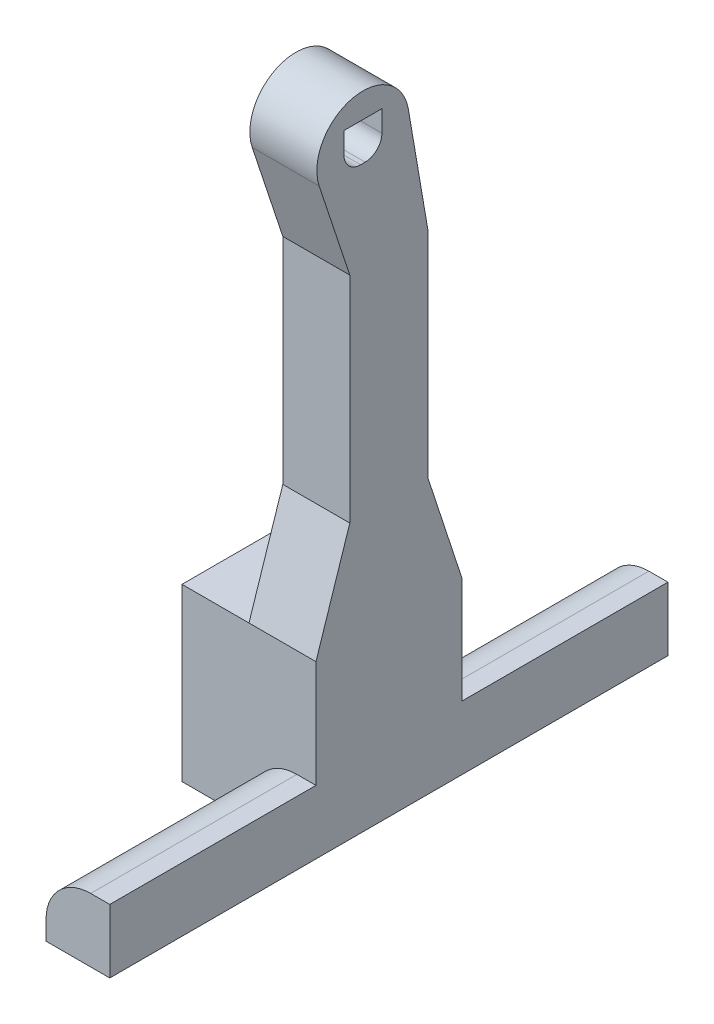
ISO-10303-21;
HEADER;
FILE_DESCRIPTION(('STEP AP214'),'2;1');
FILE_NAME('part.step','',(''),(''),'','','');
FILE_SCHEMA(('AUTOMOTIVE_DESIGN { 1 0 10303 214 1 1 1 1 }'));
ENDSEC;
DATA;
#1=APPLICATION_CONTEXT('core data for automotive mechanical design processes');
#2=APPLICATION_PROTOCOL_DEFINITION('international standard','automotive_design',2000,#1);
#3=PRODUCT_CONTEXT('',#1,'mechanical');
#4=PRODUCT('Part','Part','',(#3));
#5=PRODUCT_RELATED_PRODUCT_CATEGORY('part','',(#4));
#6=PRODUCT_DEFINITION_FORMATION('','',#4);
#7=PRODUCT_DEFINITION_CONTEXT('part definition',#1,'design');
#8=PRODUCT_DEFINITION('design','',#6,#7);
#9=PRODUCT_DEFINITION_SHAPE('','',#8);
#10=(LENGTH_UNIT() NAMED_UNIT(*) SI_UNIT(.MILLI.,.METRE.));
#11=(NAMED_UNIT(*) PLANE_ANGLE_UNIT() SI_UNIT($,.RADIAN.));
#12=(NAMED_UNIT(*) SI_UNIT($,.STERADIAN.) SOLID_ANGLE_UNIT());
#13=UNCERTAINTY_MEASURE_WITH_UNIT(LENGTH_MEASURE(1.E-05),#10,'distance_accuracy_value','');
#14=(GEOMETRIC_REPRESENTATION_CONTEXT(3) GLOBAL_UNCERTAINTY_ASSIGNED_CONTEXT((#13)) GLOBAL_UNIT_ASSIGNED_CONTEXT((#10,
#11,#12)) REPRESENTATION_CONTEXT('',''));
#15=CARTESIAN_POINT('',(0.,0.,0.));
#16=DIRECTION('',(0.,0.,1.));
#17=DIRECTION('',(1.,0.,0.));
#18=AXIS2_PLACEMENT_3D('',#15,#16,#17);
#19=CARTESIAN_POINT('',(-6.,0.,-6.5301128643398));
#20=DIRECTION('',(0.,0.,-1.));
#21=DIRECTION('',(0.,1.,0.));
#22=AXIS2_PLACEMENT_3D('',#19,#20,#21);
#23=PLANE('',#22);
#24=DIRECTION('',(0.,1.,0.));
#25=VECTOR('',#24,1.);
#26=CARTESIAN_POINT('',(6.,0.,-6.5301128643398));
#27=LINE('',#26,#25);
#28=CARTESIAN_POINT('',(6.,5.70719146421949,-6.5301128643398));
#29=VERTEX_POINT('',#28);
#30=CARTESIAN_POINT('',(6.,15.3052734001084,-6.5301128643398));
#31=VERTEX_POINT('',#30);
#32=EDGE_CURVE('E293',#29,#31,#27,.T.);
#33=ORIENTED_EDGE('',*,*,#32,.F.);
#34=DIRECTION('',(-1.,0.,0.));
#35=VECTOR('',#34,1.);
#36=CARTESIAN_POINT('',(-6.,5.70719146421949,-6.5301128643398));
#37=LINE('',#36,#35);
#38=CARTESIAN_POINT('',(4.29280853578054,5.70719146421949,-6.5301128643398));
#39=VERTEX_POINT('',#38);
#40=EDGE_CURVE('E228',#29,#39,#37,.T.);
#41=ORIENTED_EDGE('',*,*,#40,.T.);
#42=CARTESIAN_POINT('',(4.29280853578051,1.70719146421949,-6.5301128643398));
#43=DIRECTION('',(0.,0.,-1.));
#44=DIRECTION('',(0.,1.,0.));
#45=AXIS2_PLACEMENT_3D('',#42,#43,#44);
#46=CIRCLE('',#45,4.);
#47=CARTESIAN_POINT('',(0.292808535780509,1.70719146421946,-6.5301128643398));
#48=VERTEX_POINT('',#47);
#49=EDGE_CURVE('E288',#39,#48,#46,.F.);
#50=ORIENTED_EDGE('',*,*,#49,.T.);
#51=DIRECTION('',(0.,-1.,0.));
#52=VECTOR('',#51,1.);
#53=CARTESIAN_POINT('',(0.292808535780509,0.,-6.5301128643398));
#54=LINE('',#53,#52);
#55=CARTESIAN_POINT('',(0.292808535780509,0.,-6.5301128643398));
#56=VERTEX_POINT('',#55);
#57=EDGE_CURVE('E285',#48,#56,#54,.T.);
#58=ORIENTED_EDGE('',*,*,#57,.T.);
#59=DIRECTION('',(1.,0.,0.));
#60=VECTOR('',#59,1.);
#61=CARTESIAN_POINT('',(-6.,0.,-6.5301128643398));
#62=LINE('',#61,#60);
#63=CARTESIAN_POINT('',(-6.,0.,-6.5301128643398));
#64=VERTEX_POINT('',#63);
#65=EDGE_CURVE('E378',#64,#56,#62,.T.);
#66=ORIENTED_EDGE('',*,*,#65,.F.);
#67=DIRECTION('',(0.,1.,0.));
#68=VECTOR('',#67,1.);
#69=CARTESIAN_POINT('',(-6.,0.,-6.5301128643398));
#70=LINE('',#69,#68);
#71=CARTESIAN_POINT('',(-6.,15.3052734001084,-6.5301128643398));
#72=VERTEX_POINT('',#71);
#73=EDGE_CURVE('E345',#64,#72,#70,.T.);
#74=ORIENTED_EDGE('',*,*,#73,.T.);
#75=DIRECTION('',(1.,0.,0.));
#76=VECTOR('',#75,1.);
#77=CARTESIAN_POINT('',(-6.,15.3052734001084,-6.5301128643398));
#78=LINE('',#77,#76);
#79=CARTESIAN_POINT('',(0.,15.3052734001084,-6.5301128643398));
#80=VERTEX_POINT('',#79);
#81=EDGE_CURVE('E367',#72,#80,#78,.T.);
#82=ORIENTED_EDGE('',*,*,#81,.T.);
#83=DIRECTION('',(-1.,0.,0.));
#84=VECTOR('',#83,1.);
#85=CARTESIAN_POINT('',(6.,15.3052734001084,-6.5301128643398));
#86=LINE('',#85,#84);
#87=EDGE_CURVE('E343',#31,#80,#86,.T.);
#88=ORIENTED_EDGE('',*,*,#87,.F.);
#89=EDGE_LOOP('',(#33,#41,#50,#58,#66,#74,#82,#88));
#90=FACE_BOUND('',#89,.T.);
#91=ADVANCED_FACE('F37',(#90),#23,.T.);
#92=CARTESIAN_POINT('',(-6.,0.,6.5301128643398));
#93=DIRECTION('',(0.,0.,-1.));
#94=DIRECTION('',(-1.,0.,0.));
#95=AXIS2_PLACEMENT_3D('',#92,#93,#94);
#96=PLANE('',#95);
#97=DIRECTION('',(-1.,0.,0.));
#98=VECTOR('',#97,1.);
#99=CARTESIAN_POINT('',(-6.,5.70719146421949,6.5301128643398));
#100=LINE('',#99,#98);
#101=CARTESIAN_POINT('',(6.,5.70719146421949,6.5301128643398));
#102=VERTEX_POINT('',#101);
#103=CARTESIAN_POINT('',(4.29280853578054,5.70719146421949,6.5301128643398));
#104=VERTEX_POINT('',#103);
#105=EDGE_CURVE('E282',#102,#104,#100,.T.);
#106=ORIENTED_EDGE('',*,*,#105,.F.);
#107=DIRECTION('',(0.,1.,0.));
#108=VECTOR('',#107,1.);
#109=CARTESIAN_POINT('',(6.,0.,6.5301128643398));
#110=LINE('',#109,#108);
#111=CARTESIAN_POINT('',(6.,15.3052734001084,6.5301128643398));
#112=VERTEX_POINT('',#111);
#113=EDGE_CURVE('E314',#102,#112,#110,.T.);
#114=ORIENTED_EDGE('',*,*,#113,.T.);
#115=DIRECTION('',(-1.,0.,0.));
#116=VECTOR('',#115,1.);
#117=CARTESIAN_POINT('',(6.,15.3052734001084,6.5301128643398));
#118=LINE('',#117,#116);
#119=CARTESIAN_POINT('',(0.,15.3052734001084,6.5301128643398));
#120=VERTEX_POINT('',#119);
#121=EDGE_CURVE('E334',#112,#120,#118,.T.);
#122=ORIENTED_EDGE('',*,*,#121,.T.);
#123=DIRECTION('',(1.,0.,0.));
#124=VECTOR('',#123,1.);
#125=CARTESIAN_POINT('',(-6.,15.3052734001084,6.5301128643398));
#126=LINE('',#125,#124);
#127=CARTESIAN_POINT('',(-6.,15.3052734001084,6.5301128643398));
#128=VERTEX_POINT('',#127);
#129=EDGE_CURVE('E416',#128,#120,#126,.T.);
#130=ORIENTED_EDGE('',*,*,#129,.F.);
#131=DIRECTION('',(0.,1.,0.));
#132=VECTOR('',#131,1.);
#133=CARTESIAN_POINT('',(-6.,0.,6.5301128643398));
#134=LINE('',#133,#132);
#135=CARTESIAN_POINT('',(-6.,0.,6.5301128643398));
#136=VERTEX_POINT('',#135);
#137=EDGE_CURVE('E352',#136,#128,#134,.T.);
#138=ORIENTED_EDGE('',*,*,#137,.F.);
#139=DIRECTION('',(1.,0.,0.));
#140=VECTOR('',#139,1.);
#141=CARTESIAN_POINT('',(-6.,0.,6.5301128643398));
#142=LINE('',#141,#140);
#143=CARTESIAN_POINT('',(0.292808535780509,0.,6.5301128643398));
#144=VERTEX_POINT('',#143);
#145=EDGE_CURVE('E397',#136,#144,#142,.T.);
#146=ORIENTED_EDGE('',*,*,#145,.T.);
#147=DIRECTION('',(0.,-1.,0.));
#148=VECTOR('',#147,1.);
#149=CARTESIAN_POINT('',(0.292808535780509,0.,6.5301128643398));
#150=LINE('',#149,#148);
#151=CARTESIAN_POINT('',(0.292808535780509,1.70719146421946,6.5301128643398));
#152=VERTEX_POINT('',#151);
#153=EDGE_CURVE('E44',#152,#144,#150,.T.);
#154=ORIENTED_EDGE('',*,*,#153,.F.);
#155=CARTESIAN_POINT('',(4.29280853578051,1.70719146421949,6.5301128643398));
#156=DIRECTION('',(0.,0.,-1.));
#157=DIRECTION('',(-1.,0.,0.));
#158=AXIS2_PLACEMENT_3D('',#155,#156,#157);
#159=CIRCLE('',#158,4.);
#160=EDGE_CURVE('E11',#104,#152,#159,.F.);
#161=ORIENTED_EDGE('',*,*,#160,.F.);
#162=EDGE_LOOP('',(#106,#114,#122,#130,#138,#146,#154,#161));
#163=FACE_BOUND('',#162,.T.);
#164=ADVANCED_FACE('F439',(#163),#96,.F.);
#165=CARTESIAN_POINT('',(-6.,0.,0.));
#166=DIRECTION('',(0.,-1.,0.));
#167=DIRECTION('',(0.,0.,-1.));
#168=AXIS2_PLACEMENT_3D('',#165,#166,#167);
#169=PLANE('',#168);
#170=DIRECTION('',(0.,0.,-1.));
#171=VECTOR('',#170,1.);
#172=CARTESIAN_POINT('',(0.292808535780509,0.,25.));
#173=LINE('',#172,#171);
#174=CARTESIAN_POINT('',(0.292808535780509,0.,25.));
#175=VERTEX_POINT('',#174);
#176=EDGE_CURVE('E271',#175,#144,#173,.T.);
#177=ORIENTED_EDGE('',*,*,#176,.T.);
#178=ORIENTED_EDGE('',*,*,#145,.F.);
#179=DIRECTION('',(0.,0.,1.));
#180=VECTOR('',#179,1.);
#181=CARTESIAN_POINT('',(-6.,0.,0.));
#182=LINE('',#181,#180);
#183=CARTESIAN_POINT('',(-6.,0.,3.));
#184=VERTEX_POINT('',#183);
#185=EDGE_CURVE('E354',#184,#136,#182,.T.);
#186=ORIENTED_EDGE('',*,*,#185,.F.);
#187=DIRECTION('',(1.,0.,0.));
#188=VECTOR('',#187,1.);
#189=CARTESIAN_POINT('',(-6.,0.,3.));
#190=LINE('',#189,#188);
#191=CARTESIAN_POINT('',(0.,0.,3.));
#192=VERTEX_POINT('',#191);
#193=EDGE_CURVE('E393',#184,#192,#190,.T.);
#194=ORIENTED_EDGE('',*,*,#193,.T.);
#195=DIRECTION('',(0.,0.,1.));
#196=VECTOR('',#195,1.);
#197=CARTESIAN_POINT('',(0.,0.,0.));
#198=LINE('',#197,#196);
#199=CARTESIAN_POINT('',(0.,0.,-3.));
#200=VERTEX_POINT('',#199);
#201=EDGE_CURVE('E291',#200,#192,#198,.T.);
#202=ORIENTED_EDGE('',*,*,#201,.F.);
#203=DIRECTION('',(1.,0.,0.));
#204=VECTOR('',#203,1.);
#205=CARTESIAN_POINT('',(-6.,0.,-3.));
#206=LINE('',#205,#204);
#207=CARTESIAN_POINT('',(-6.,0.,-3.));
#208=VERTEX_POINT('',#207);
#209=EDGE_CURVE('E385',#208,#200,#206,.T.);
#210=ORIENTED_EDGE('',*,*,#209,.F.);
#211=DIRECTION('',(0.,0.,-1.));
#212=VECTOR('',#211,1.);
#213=CARTESIAN_POINT('',(-6.,0.,0.));
#214=LINE('',#213,#212);
#215=EDGE_CURVE('E364',#208,#64,#214,.T.);
#216=ORIENTED_EDGE('',*,*,#215,.T.);
#217=ORIENTED_EDGE('',*,*,#65,.T.);
#218=CARTESIAN_POINT('',(0.292808535780509,0.,-25.));
#219=VERTEX_POINT('',#218);
#220=EDGE_CURVE('E270',#56,#219,#173,.T.);
#221=ORIENTED_EDGE('',*,*,#220,.T.);
#222=DIRECTION('',(1.,0.,0.));
#223=VECTOR('',#222,1.);
#224=CARTESIAN_POINT('',(6.,0.,-25.));
#225=LINE('',#224,#223);
#226=CARTESIAN_POINT('',(6.,0.,-25.));
#227=VERTEX_POINT('',#226);
#228=EDGE_CURVE('E256',#219,#227,#225,.T.);
#229=ORIENTED_EDGE('',*,*,#228,.T.);
#230=DIRECTION('',(0.,0.,1.));
#231=VECTOR('',#230,1.);
#232=CARTESIAN_POINT('',(6.,0.,0.));
#233=LINE('',#232,#231);
#234=CARTESIAN_POINT('',(6.,0.,25.));
#235=VERTEX_POINT('',#234);
#236=EDGE_CURVE('E249',#227,#235,#233,.T.);
#237=ORIENTED_EDGE('',*,*,#236,.T.);
#238=DIRECTION('',(1.,0.,0.));
#239=VECTOR('',#238,1.);
#240=CARTESIAN_POINT('',(6.,0.,25.));
#241=LINE('',#240,#239);
#242=EDGE_CURVE('E267',#175,#235,#241,.T.);
#243=ORIENTED_EDGE('',*,*,#242,.F.);
#244=EDGE_LOOP('',(#177,#178,#186,#194,#202,#210,#216,#217,#221,#229,#237,#243));
#245=FACE_BOUND('',#244,.T.);
#246=ADVANCED_FACE('F403',(#245),#169,.T.);
#247=CARTESIAN_POINT('',(-6.,0.,-3.));
#248=DIRECTION('',(0.,0.,1.));
#249=DIRECTION('',(0.,-1.,0.));
#250=AXIS2_PLACEMENT_3D('',#247,#248,#249);
#251=PLANE('',#250);
#252=DIRECTION('',(0.,-1.,0.));
#253=VECTOR('',#252,1.);
#254=CARTESIAN_POINT('',(0.,0.,-3.));
#255=LINE('',#254,#253);
#256=CARTESIAN_POINT('',(0.,9.82,-3.));
#257=VERTEX_POINT('',#256);
#258=EDGE_CURVE('E349',#257,#200,#255,.T.);
#259=ORIENTED_EDGE('',*,*,#258,.F.);
#260=DIRECTION('',(1.,0.,0.));
#261=VECTOR('',#260,1.);
#262=CARTESIAN_POINT('',(-6.,9.82,-3.));
#263=LINE('',#262,#261);
#264=CARTESIAN_POINT('',(-6.,9.82,-3.));
#265=VERTEX_POINT('',#264);
#266=EDGE_CURVE('E387',#265,#257,#263,.T.);
#267=ORIENTED_EDGE('',*,*,#266,.F.);
#268=DIRECTION('',(0.,-1.,0.));
#269=VECTOR('',#268,1.);
#270=CARTESIAN_POINT('',(-6.,0.,-3.));
#271=LINE('',#270,#269);
#272=EDGE_CURVE('E361',#265,#208,#271,.T.);
#273=ORIENTED_EDGE('',*,*,#272,.T.);
#274=ORIENTED_EDGE('',*,*,#209,.T.);
#275=EDGE_LOOP('',(#259,#267,#273,#274));
#276=FACE_BOUND('',#275,.T.);
#277=ADVANCED_FACE('F428',(#276),#251,.T.);
#278=CARTESIAN_POINT('',(-6.,9.82,0.));
#279=DIRECTION('',(0.,-1.,0.));
#280=DIRECTION('',(0.,0.,-1.));
#281=AXIS2_PLACEMENT_3D('',#278,#279,#280);
#282=PLANE('',#281);
#283=DIRECTION('',(0.,0.,-1.));
#284=VECTOR('',#283,1.);
#285=CARTESIAN_POINT('',(0.,9.82,0.));
#286=LINE('',#285,#284);
#287=CARTESIAN_POINT('',(0.,9.82,3.));
#288=VERTEX_POINT('',#287);
#289=EDGE_CURVE('E373',#288,#257,#286,.T.);
#290=ORIENTED_EDGE('',*,*,#289,.F.);
#291=DIRECTION('',(1.,0.,0.));
#292=VECTOR('',#291,1.);
#293=CARTESIAN_POINT('',(-6.,9.82,3.));
#294=LINE('',#293,#292);
#295=CARTESIAN_POINT('',(-6.,9.82,3.));
#296=VERTEX_POINT('',#295);
#297=EDGE_CURVE('E396',#296,#288,#294,.T.);
#298=ORIENTED_EDGE('',*,*,#297,.F.);
#299=DIRECTION('',(0.,0.,-1.));
#300=VECTOR('',#299,1.);
#301=CARTESIAN_POINT('',(-6.,9.82,0.));
#302=LINE('',#301,#300);
#303=EDGE_CURVE('E358',#296,#265,#302,.T.);
#304=ORIENTED_EDGE('',*,*,#303,.T.);
#305=ORIENTED_EDGE('',*,*,#266,.T.);
#306=EDGE_LOOP('',(#290,#298,#304,#305));
#307=FACE_BOUND('',#306,.T.);
#308=ADVANCED_FACE('F424',(#307),#282,.T.);
#309=CARTESIAN_POINT('',(-6.,0.,3.));
#310=DIRECTION('',(0.,0.,1.));
#311=DIRECTION('',(0.,-1.,0.));
#312=AXIS2_PLACEMENT_3D('',#309,#310,#311);
#313=PLANE('',#312);
#314=DIRECTION('',(0.,-1.,0.));
#315=VECTOR('',#314,1.);
#316=CARTESIAN_POINT('',(0.,0.,3.));
#317=LINE('',#316,#315);
#318=EDGE_CURVE('E371',#288,#192,#317,.T.);
#319=ORIENTED_EDGE('',*,*,#318,.T.);
#320=ORIENTED_EDGE('',*,*,#193,.F.);
#321=DIRECTION('',(0.,-1.,0.));
#322=VECTOR('',#321,1.);
#323=CARTESIAN_POINT('',(-6.,0.,3.));
#324=LINE('',#323,#322);
#325=EDGE_CURVE('E356',#296,#184,#324,.T.);
#326=ORIENTED_EDGE('',*,*,#325,.F.);
#327=ORIENTED_EDGE('',*,*,#297,.T.);
#328=EDGE_LOOP('',(#319,#320,#326,#327));
#329=FACE_BOUND('',#328,.T.);
#330=ADVANCED_FACE('F434',(#329),#313,.F.);
#331=CARTESIAN_POINT('',(-6.,15.3052734001084,0.));
#332=DIRECTION('',(0.,1.,0.));
#333=DIRECTION('',(0.,0.,1.));
#334=AXIS2_PLACEMENT_3D('',#331,#332,#333);
#335=PLANE('',#334);
#336=DIRECTION('',(0.,0.,1.));
#337=VECTOR('',#336,1.);
#338=CARTESIAN_POINT('',(0.,15.3052734001084,0.));
#339=LINE('',#338,#337);
#340=EDGE_CURVE('E368',#80,#120,#339,.T.);
#341=ORIENTED_EDGE('',*,*,#340,.F.);
#342=ORIENTED_EDGE('',*,*,#81,.F.);
#343=DIRECTION('',(0.,0.,1.));
#344=VECTOR('',#343,1.);
#345=CARTESIAN_POINT('',(-6.,15.3052734001084,0.));
#346=LINE('',#345,#344);
#347=EDGE_CURVE('E348',#72,#128,#346,.T.);
#348=ORIENTED_EDGE('',*,*,#347,.T.);
#349=ORIENTED_EDGE('',*,*,#129,.T.);
#350=EDGE_LOOP('',(#341,#342,#348,#349));
#351=FACE_BOUND('',#350,.T.);
#352=ADVANCED_FACE('F415',(#351),#335,.T.);
#353=CARTESIAN_POINT('',(-6.,0.,0.));
#354=DIRECTION('',(1.,0.,0.));
#355=DIRECTION('',(0.,0.,-1.));
#356=AXIS2_PLACEMENT_3D('',#353,#354,#355);
#357=PLANE('',#356);
#358=ORIENTED_EDGE('',*,*,#73,.F.);
#359=ORIENTED_EDGE('',*,*,#215,.F.);
#360=ORIENTED_EDGE('',*,*,#272,.F.);
#361=ORIENTED_EDGE('',*,*,#303,.F.);
#362=ORIENTED_EDGE('',*,*,#325,.T.);
#363=ORIENTED_EDGE('',*,*,#185,.T.);
#364=ORIENTED_EDGE('',*,*,#137,.T.);
#365=ORIENTED_EDGE('',*,*,#347,.F.);
#366=EDGE_LOOP('',(#358,#359,#360,#361,#362,#363,#364,#365));
#367=FACE_BOUND('',#366,.T.);
#368=ADVANCED_FACE('F409',(#367),#357,.F.);
#369=CARTESIAN_POINT('',(0.,0.,0.));
#370=DIRECTION('',(1.,0.,0.));
#371=DIRECTION('',(0.,0.,-1.));
#372=AXIS2_PLACEMENT_3D('',#369,#370,#371);
#373=PLANE('',#372);
#374=CARTESIAN_POINT('',(0.,53.3529147373515,2.12440256807779));
#375=DIRECTION('',(1.,0.,0.));
#376=DIRECTION('',(0.,0.,-1.));
#377=AXIS2_PLACEMENT_3D('',#374,#375,#376);
#378=CIRCLE('',#377,1.5);
#379=CARTESIAN_POINT('',(0.,51.8529147373515,2.12440256807779));
#380=VERTEX_POINT('',#379);
#381=CARTESIAN_POINT('',(0.,53.3529147373515,0.62440256807779));
#382=VERTEX_POINT('',#381);
#383=EDGE_CURVE('E454',#380,#382,#378,.T.);
#384=ORIENTED_EDGE('',*,*,#383,.T.);
#385=DIRECTION('',(0.,1.,0.));
#386=VECTOR('',#385,1.);
#387=CARTESIAN_POINT('',(0.,0.,0.624402568077751));
#388=LINE('',#387,#386);
#389=CARTESIAN_POINT('',(0.,55.2529147373515,0.624402568077792));
#390=VERTEX_POINT('',#389);
#391=EDGE_CURVE('E294',#382,#390,#388,.T.);
#392=ORIENTED_EDGE('',*,*,#391,.T.);
#393=DIRECTION('',(0.,0.,1.));
#394=VECTOR('',#393,1.);
#395=CARTESIAN_POINT('',(0.,55.2529147373515,0.));
#396=LINE('',#395,#394);
#397=CARTESIAN_POINT('',(0.,55.2529147373515,4.02440256807779));
#398=VERTEX_POINT('',#397);
#399=EDGE_CURVE('E472',#390,#398,#396,.T.);
#400=ORIENTED_EDGE('',*,*,#399,.T.);
#401=DIRECTION('',(0.,-1.,0.));
#402=VECTOR('',#401,1.);
#403=CARTESIAN_POINT('',(0.,0.,4.02440256807779));
#404=LINE('',#403,#402);
#405=CARTESIAN_POINT('',(0.,53.3529147373515,4.02440256807779));
#406=VERTEX_POINT('',#405);
#407=EDGE_CURVE('E469',#398,#406,#404,.T.);
#408=ORIENTED_EDGE('',*,*,#407,.T.);
#409=CARTESIAN_POINT('',(0.,53.3529147373515,2.52440256807779));
#410=DIRECTION('',(1.,0.,0.));
#411=DIRECTION('',(0.,0.,-1.));
#412=AXIS2_PLACEMENT_3D('',#409,#410,#411);
#413=CIRCLE('',#412,1.5);
#414=CARTESIAN_POINT('',(0.,51.8529147373515,2.52440256807779));
#415=VERTEX_POINT('',#414);
#416=EDGE_CURVE('E466',#406,#415,#413,.T.);
#417=ORIENTED_EDGE('',*,*,#416,.T.);
#418=DIRECTION('',(0.,0.,-1.));
#419=VECTOR('',#418,1.);
#420=CARTESIAN_POINT('',(0.,51.8529147373515,0.));
#421=LINE('',#420,#419);
#422=EDGE_CURVE('E458',#415,#380,#421,.T.);
#423=ORIENTED_EDGE('',*,*,#422,.T.);
#424=EDGE_LOOP('',(#384,#392,#400,#408,#417,#423));
#425=FACE_BOUND('',#424,.T.);
#426=DIRECTION('',(0.,0.950124627316356,0.311870474022399));
#427=VECTOR('',#426,1.);
#428=CARTESIAN_POINT('',(0.,3.42361548839065,-10.4301678450909));
#429=LINE('',#428,#427);
#430=CARTESIAN_POINT('',(0.,24.5416661735185,-3.49834407350584));
#431=VERTEX_POINT('',#430);
#432=EDGE_CURVE('E337',#80,#431,#429,.T.);
#433=ORIENTED_EDGE('',*,*,#432,.F.);
#434=ORIENTED_EDGE('',*,*,#340,.T.);
#435=DIRECTION('',(0.,0.950124627316356,-0.311870474022399));
#436=VECTOR('',#435,1.);
#437=CARTESIAN_POINT('',(0.,3.42361548839065,10.4301678450909));
#438=LINE('',#437,#436);
#439=CARTESIAN_POINT('',(0.,24.5416661735185,3.49834407350584));
#440=VERTEX_POINT('',#439);
#441=EDGE_CURVE('E449',#120,#440,#438,.T.);
#442=ORIENTED_EDGE('',*,*,#441,.T.);
#443=DIRECTION('',(0.,1.,0.));
#444=VECTOR('',#443,1.);
#445=CARTESIAN_POINT('',(0.,0.,3.49834407350584));
#446=LINE('',#445,#444);
#447=CARTESIAN_POINT('',(0.,43.7787186309198,3.49834407350584));
#448=VERTEX_POINT('',#447);
#449=EDGE_CURVE('E455',#440,#448,#446,.T.);
#450=ORIENTED_EDGE('',*,*,#449,.T.);
#451=DIRECTION('',(0.,0.949242025128971,0.314546622504598));
#452=VECTOR('',#451,1.);
#453=CARTESIAN_POINT('',(0.,3.28690930753715,-9.91926863705626));
#454=LINE('',#453,#452);
#455=CARTESIAN_POINT('',(0.,52.0551313380164,6.24086662787512));
#456=VERTEX_POINT('',#455);
#457=EDGE_CURVE('E460',#448,#456,#454,.T.);
#458=ORIENTED_EDGE('',*,*,#457,.T.);
#459=CARTESIAN_POINT('',(0.,53.3529147373503,2.32440256807876));
#460=DIRECTION('',(1.,0.,0.));
#461=DIRECTION('',(0.,0.,-1.));
#462=AXIS2_PLACEMENT_3D('',#459,#460,#461);
#463=CIRCLE('',#462,4.12588566047114);
#464=CARTESIAN_POINT('',(0.,54.0482643780858,-1.74246617340142));
#465=VERTEX_POINT('',#464);
#466=EDGE_CURVE('E513',#456,#465,#463,.F.);
#467=ORIENTED_EDGE('',*,*,#466,.T.);
#468=DIRECTION('',(0.,0.985695939284439,0.168533424809938));
#469=VECTOR('',#468,1.);
#470=CARTESIAN_POINT('',(0.,1.82462391013203,-10.6716182915449));
#471=LINE('',#470,#469);
#472=CARTESIAN_POINT('',(0.,43.7787186309198,-3.49834407350584));
#473=VERTEX_POINT('',#472);
#474=EDGE_CURVE('E510',#473,#465,#471,.T.);
#475=ORIENTED_EDGE('',*,*,#474,.F.);
#476=DIRECTION('',(0.,1.,0.));
#477=VECTOR('',#476,1.);
#478=CARTESIAN_POINT('',(0.,0.,-3.49834407350584));
#479=LINE('',#478,#477);
#480=EDGE_CURVE('E509',#431,#473,#479,.T.);
#481=ORIENTED_EDGE('',*,*,#480,.F.);
#482=EDGE_LOOP('',(#433,#434,#442,#450,#458,#467,#475,#481));
#483=FACE_BOUND('',#482,.T.);
#484=ADVANCED_FACE('F507',(#425,#483),#373,.F.);
#485=CARTESIAN_POINT('',(6.,53.3529147373515,2.12440256807779));
#486=DIRECTION('',(-1.,0.,0.));
#487=DIRECTION('',(0.,0.,1.));
#488=AXIS2_PLACEMENT_3D('',#485,#486,#487);
#489=CYLINDRICAL_SURFACE('',#488,1.5);
#490=ORIENTED_EDGE('',*,*,#383,.F.);
#491=DIRECTION('',(-1.,0.,0.));
#492=VECTOR('',#491,1.);
#493=CARTESIAN_POINT('',(6.,51.8529147373515,2.12440256807779));
#494=LINE('',#493,#492);
#495=CARTESIAN_POINT('',(6.,51.8529147373515,2.12440256807779));
#496=VERTEX_POINT('',#495);
#497=EDGE_CURVE('E372',#496,#380,#494,.T.);
#498=ORIENTED_EDGE('',*,*,#497,.F.);
#499=CARTESIAN_POINT('',(6.,53.3529147373515,2.12440256807779));
#500=DIRECTION('',(1.,0.,0.));
#501=DIRECTION('',(0.,0.,-1.));
#502=AXIS2_PLACEMENT_3D('',#499,#500,#501);
#503=CIRCLE('',#502,1.5);
#504=CARTESIAN_POINT('',(6.,53.3529147373515,0.62440256807779));
#505=VERTEX_POINT('',#504);
#506=EDGE_CURVE('E316',#496,#505,#503,.T.);
#507=ORIENTED_EDGE('',*,*,#506,.T.);
#508=DIRECTION('',(-1.,0.,0.));
#509=VECTOR('',#508,1.);
#510=CARTESIAN_POINT('',(6.,53.3529147373515,0.62440256807779));
#511=LINE('',#510,#509);
#512=EDGE_CURVE('E477',#505,#382,#511,.T.);
#513=ORIENTED_EDGE('',*,*,#512,.T.);
#514=EDGE_LOOP('',(#490,#498,#507,#513));
#515=FACE_BOUND('',#514,.T.);
#516=ADVANCED_FACE('F600',(#515),#489,.F.);
#517=CARTESIAN_POINT('',(6.,51.8529147373515,0.));
#518=DIRECTION('',(0.,1.,0.));
#519=DIRECTION('',(0.,0.,1.));
#520=AXIS2_PLACEMENT_3D('',#517,#518,#519);
#521=PLANE('',#520);
#522=ORIENTED_EDGE('',*,*,#422,.F.);
#523=DIRECTION('',(-1.,0.,0.));
#524=VECTOR('',#523,1.);
#525=CARTESIAN_POINT('',(6.,51.8529147373515,2.52440256807779));
#526=LINE('',#525,#524);
#527=CARTESIAN_POINT('',(6.,51.8529147373515,2.52440256807779));
#528=VERTEX_POINT('',#527);
#529=EDGE_CURVE('E485',#528,#415,#526,.T.);
#530=ORIENTED_EDGE('',*,*,#529,.F.);
#531=DIRECTION('',(0.,0.,-1.));
#532=VECTOR('',#531,1.);
#533=CARTESIAN_POINT('',(6.,51.8529147373515,0.));
#534=LINE('',#533,#532);
#535=EDGE_CURVE('E319',#528,#496,#534,.T.);
#536=ORIENTED_EDGE('',*,*,#535,.T.);
#537=ORIENTED_EDGE('',*,*,#497,.T.);
#538=EDGE_LOOP('',(#522,#530,#536,#537));
#539=FACE_BOUND('',#538,.T.);
#540=ADVANCED_FACE('F603',(#539),#521,.T.);
#541=CARTESIAN_POINT('',(6.,53.3529147373515,2.52440256807779));
#542=DIRECTION('',(-1.,0.,0.));
#543=DIRECTION('',(0.,0.,1.));
#544=AXIS2_PLACEMENT_3D('',#541,#542,#543);
#545=CYLINDRICAL_SURFACE('',#544,1.5);
#546=ORIENTED_EDGE('',*,*,#416,.F.);
#547=DIRECTION('',(-1.,0.,0.));
#548=VECTOR('',#547,1.);
#549=CARTESIAN_POINT('',(6.,53.3529147373515,4.02440256807779));
#550=LINE('',#549,#548);
#551=CARTESIAN_POINT('',(6.,53.3529147373515,4.02440256807779));
#552=VERTEX_POINT('',#551);
#553=EDGE_CURVE('E483',#552,#406,#550,.T.);
#554=ORIENTED_EDGE('',*,*,#553,.F.);
#555=CARTESIAN_POINT('',(6.,53.3529147373515,2.52440256807779));
#556=DIRECTION('',(1.,0.,0.));
#557=DIRECTION('',(0.,0.,-1.));
#558=AXIS2_PLACEMENT_3D('',#555,#556,#557);
#559=CIRCLE('',#558,1.5);
#560=EDGE_CURVE('E322',#552,#528,#559,.T.);
#561=ORIENTED_EDGE('',*,*,#560,.T.);
#562=ORIENTED_EDGE('',*,*,#529,.T.);
#563=EDGE_LOOP('',(#546,#554,#561,#562));
#564=FACE_BOUND('',#563,.T.);
#565=ADVANCED_FACE('F607',(#564),#545,.F.);
#566=CARTESIAN_POINT('',(6.,0.,4.02440256807779));
#567=DIRECTION('',(0.,0.,-1.));
#568=DIRECTION('',(-1.,0.,0.));
#569=AXIS2_PLACEMENT_3D('',#566,#567,#568);
#570=PLANE('',#569);
#571=ORIENTED_EDGE('',*,*,#407,.F.);
#572=DIRECTION('',(-1.,0.,0.));
#573=VECTOR('',#572,1.);
#574=CARTESIAN_POINT('',(6.,55.2529147373515,4.02440256807779));
#575=LINE('',#574,#573);
#576=CARTESIAN_POINT('',(6.,55.2529147373515,4.02440256807779));
#577=VERTEX_POINT('',#576);
#578=EDGE_CURVE('E481',#577,#398,#575,.T.);
#579=ORIENTED_EDGE('',*,*,#578,.F.);
#580=DIRECTION('',(0.,-1.,0.));
#581=VECTOR('',#580,1.);
#582=CARTESIAN_POINT('',(6.,0.,4.02440256807779));
#583=LINE('',#582,#581);
#584=EDGE_CURVE('E325',#577,#552,#583,.T.);
#585=ORIENTED_EDGE('',*,*,#584,.T.);
#586=ORIENTED_EDGE('',*,*,#553,.T.);
#587=EDGE_LOOP('',(#571,#579,#585,#586));
#588=FACE_BOUND('',#587,.T.);
#589=ADVANCED_FACE('F611',(#588),#570,.T.);
#590=CARTESIAN_POINT('',(6.,55.2529147373515,0.));
#591=DIRECTION('',(0.,-1.,0.));
#592=DIRECTION('',(0.,0.,-1.));
#593=AXIS2_PLACEMENT_3D('',#590,#591,#592);
#594=PLANE('',#593);
#595=ORIENTED_EDGE('',*,*,#399,.F.);
#596=DIRECTION('',(-1.,0.,0.));
#597=VECTOR('',#596,1.);
#598=CARTESIAN_POINT('',(6.,55.2529147373515,0.624402568077792));
#599=LINE('',#598,#597);
#600=CARTESIAN_POINT('',(6.,55.2529147373515,0.624402568077792));
#601=VERTEX_POINT('',#600);
#602=EDGE_CURVE('E479',#601,#390,#599,.T.);
#603=ORIENTED_EDGE('',*,*,#602,.F.);
#604=DIRECTION('',(0.,0.,1.));
#605=VECTOR('',#604,1.);
#606=CARTESIAN_POINT('',(6.,55.2529147373515,0.));
#607=LINE('',#606,#605);
#608=EDGE_CURVE('E328',#601,#577,#607,.T.);
#609=ORIENTED_EDGE('',*,*,#608,.T.);
#610=ORIENTED_EDGE('',*,*,#578,.T.);
#611=EDGE_LOOP('',(#595,#603,#609,#610));
#612=FACE_BOUND('',#611,.T.);
#613=ADVANCED_FACE('F584',(#612),#594,.T.);
#614=CARTESIAN_POINT('',(6.,3.42361548839065,-10.4301678450909));
#615=DIRECTION('',(0.,-0.311870474022399,0.950124627316356));
#616=DIRECTION('',(0.,-0.950124627316356,-0.311870474022399));
#617=AXIS2_PLACEMENT_3D('',#614,#615,#616);
#618=PLANE('',#617);
#619=ORIENTED_EDGE('',*,*,#432,.T.);
#620=DIRECTION('',(-1.,0.,0.));
#621=VECTOR('',#620,1.);
#622=CARTESIAN_POINT('',(6.,24.5416661735185,-3.49834407350584));
#623=LINE('',#622,#621);
#624=CARTESIAN_POINT('',(6.,24.5416661735185,-3.49834407350584));
#625=VERTEX_POINT('',#624);
#626=EDGE_CURVE('E497',#625,#431,#623,.T.);
#627=ORIENTED_EDGE('',*,*,#626,.F.);
#628=DIRECTION('',(0.,0.950124627316356,0.311870474022399));
#629=VECTOR('',#628,1.);
#630=CARTESIAN_POINT('',(6.,3.42361548839065,-10.4301678450909));
#631=LINE('',#630,#629);
#632=EDGE_CURVE('E296',#31,#625,#631,.T.);
#633=ORIENTED_EDGE('',*,*,#632,.F.);
#634=ORIENTED_EDGE('',*,*,#87,.T.);
#635=EDGE_LOOP('',(#619,#627,#633,#634));
#636=FACE_BOUND('',#635,.T.);
#637=ADVANCED_FACE('F506',(#636),#618,.F.);
#638=CARTESIAN_POINT('',(6.,0.,-3.49834407350584));
#639=DIRECTION('',(0.,0.,1.));
#640=DIRECTION('',(0.,-1.,0.));
#641=AXIS2_PLACEMENT_3D('',#638,#639,#640);
#642=PLANE('',#641);
#643=ORIENTED_EDGE('',*,*,#480,.T.);
#644=DIRECTION('',(-1.,0.,0.));
#645=VECTOR('',#644,1.);
#646=CARTESIAN_POINT('',(6.,43.7787186309198,-3.49834407350584));
#647=LINE('',#646,#645);
#648=CARTESIAN_POINT('',(6.,43.7787186309198,-3.49834407350584));
#649=VERTEX_POINT('',#648);
#650=EDGE_CURVE('E495',#649,#473,#647,.T.);
#651=ORIENTED_EDGE('',*,*,#650,.F.);
#652=DIRECTION('',(0.,1.,0.));
#653=VECTOR('',#652,1.);
#654=CARTESIAN_POINT('',(6.,0.,-3.49834407350584));
#655=LINE('',#654,#653);
#656=EDGE_CURVE('E298',#625,#649,#655,.T.);
#657=ORIENTED_EDGE('',*,*,#656,.F.);
#658=ORIENTED_EDGE('',*,*,#626,.T.);
#659=EDGE_LOOP('',(#643,#651,#657,#658));
#660=FACE_BOUND('',#659,.T.);
#661=ADVANCED_FACE('F530',(#660),#642,.F.);
#662=CARTESIAN_POINT('',(6.,1.82462391013203,-10.6716182915449));
#663=DIRECTION('',(0.,-0.168533424809938,0.985695939284439));
#664=DIRECTION('',(0.,-0.985695939284439,-0.168533424809938));
#665=AXIS2_PLACEMENT_3D('',#662,#663,#664);
#666=PLANE('',#665);
#667=ORIENTED_EDGE('',*,*,#474,.T.);
#668=DIRECTION('',(-1.,0.,0.));
#669=VECTOR('',#668,1.);
#670=CARTESIAN_POINT('',(6.,54.0482643780858,-1.74246617340142));
#671=LINE('',#670,#669);
#672=CARTESIAN_POINT('',(6.,54.0482643780858,-1.74246617340142));
#673=VERTEX_POINT('',#672);
#674=EDGE_CURVE('E493',#673,#465,#671,.T.);
#675=ORIENTED_EDGE('',*,*,#674,.F.);
#676=DIRECTION('',(0.,0.985695939284439,0.168533424809938));
#677=VECTOR('',#676,1.);
#678=CARTESIAN_POINT('',(6.,1.82462391013203,-10.6716182915449));
#679=LINE('',#678,#677);
#680=EDGE_CURVE('E300',#649,#673,#679,.T.);
#681=ORIENTED_EDGE('',*,*,#680,.F.);
#682=ORIENTED_EDGE('',*,*,#650,.T.);
#683=EDGE_LOOP('',(#667,#675,#681,#682));
#684=FACE_BOUND('',#683,.T.);
#685=ADVANCED_FACE('F529',(#684),#666,.F.);
#686=CARTESIAN_POINT('',(6.,53.3529147373503,2.32440256807876));
#687=DIRECTION('',(-1.,0.,0.));
#688=DIRECTION('',(0.,0.,1.));
#689=AXIS2_PLACEMENT_3D('',#686,#687,#688);
#690=CYLINDRICAL_SURFACE('',#689,4.12588566047114);
#691=ORIENTED_EDGE('',*,*,#466,.F.);
#692=DIRECTION('',(-1.,0.,0.));
#693=VECTOR('',#692,1.);
#694=CARTESIAN_POINT('',(6.,52.0551313380164,6.24086662787512));
#695=LINE('',#694,#693);
#696=CARTESIAN_POINT('',(6.,52.0551313380164,6.24086662787512));
#697=VERTEX_POINT('',#696);
#698=EDGE_CURVE('E491',#697,#456,#695,.T.);
#699=ORIENTED_EDGE('',*,*,#698,.F.);
#700=CARTESIAN_POINT('',(6.,53.3529147373503,2.32440256807876));
#701=DIRECTION('',(1.,0.,0.));
#702=DIRECTION('',(0.,0.,-1.));
#703=AXIS2_PLACEMENT_3D('',#700,#701,#702);
#704=CIRCLE('',#703,4.12588566047114);
#705=EDGE_CURVE('E302',#697,#673,#704,.F.);
#706=ORIENTED_EDGE('',*,*,#705,.T.);
#707=ORIENTED_EDGE('',*,*,#674,.T.);
#708=EDGE_LOOP('',(#691,#699,#706,#707));
#709=FACE_BOUND('',#708,.T.);
#710=ADVANCED_FACE('F525',(#709),#690,.T.);
#711=CARTESIAN_POINT('',(6.,3.28690930753715,-9.91926863705626));
#712=DIRECTION('',(0.,-0.314546622504598,0.949242025128971));
#713=DIRECTION('',(0.,-0.949242025128971,-0.314546622504598));
#714=AXIS2_PLACEMENT_3D('',#711,#712,#713);
#715=PLANE('',#714);
#716=ORIENTED_EDGE('',*,*,#457,.F.);
#717=DIRECTION('',(-1.,0.,0.));
#718=VECTOR('',#717,1.);
#719=CARTESIAN_POINT('',(6.,43.7787186309198,3.49834407350584));
#720=LINE('',#719,#718);
#721=CARTESIAN_POINT('',(6.,43.7787186309198,3.49834407350584));
#722=VERTEX_POINT('',#721);
#723=EDGE_CURVE('E489',#722,#448,#720,.T.);
#724=ORIENTED_EDGE('',*,*,#723,.F.);
#725=DIRECTION('',(0.,0.949242025128971,0.314546622504598));
#726=VECTOR('',#725,1.);
#727=CARTESIAN_POINT('',(6.,3.28690930753715,-9.91926863705626));
#728=LINE('',#727,#726);
#729=EDGE_CURVE('E305',#722,#697,#728,.T.);
#730=ORIENTED_EDGE('',*,*,#729,.T.);
#731=ORIENTED_EDGE('',*,*,#698,.T.);
#732=EDGE_LOOP('',(#716,#724,#730,#731));
#733=FACE_BOUND('',#732,.T.);
#734=ADVANCED_FACE('F521',(#733),#715,.T.);
#735=CARTESIAN_POINT('',(6.,0.,3.49834407350584));
#736=DIRECTION('',(0.,0.,1.));
#737=DIRECTION('',(0.,-1.,0.));
#738=AXIS2_PLACEMENT_3D('',#735,#736,#737);
#739=PLANE('',#738);
#740=ORIENTED_EDGE('',*,*,#449,.F.);
#741=DIRECTION('',(-1.,0.,0.));
#742=VECTOR('',#741,1.);
#743=CARTESIAN_POINT('',(6.,24.5416661735185,3.49834407350584));
#744=LINE('',#743,#742);
#745=CARTESIAN_POINT('',(6.,24.5416661735185,3.49834407350584));
#746=VERTEX_POINT('',#745);
#747=EDGE_CURVE('E446',#746,#440,#744,.T.);
#748=ORIENTED_EDGE('',*,*,#747,.F.);
#749=DIRECTION('',(0.,1.,0.));
#750=VECTOR('',#749,1.);
#751=CARTESIAN_POINT('',(6.,0.,3.49834407350584));
#752=LINE('',#751,#750);
#753=EDGE_CURVE('E308',#746,#722,#752,.T.);
#754=ORIENTED_EDGE('',*,*,#753,.T.);
#755=ORIENTED_EDGE('',*,*,#723,.T.);
#756=EDGE_LOOP('',(#740,#748,#754,#755));
#757=FACE_BOUND('',#756,.T.);
#758=ADVANCED_FACE('F593',(#757),#739,.T.);
#759=CARTESIAN_POINT('',(6.,3.42361548839065,10.4301678450909));
#760=DIRECTION('',(0.,0.311870474022399,0.950124627316356));
#761=DIRECTION('',(0.,-0.950124627316356,0.311870474022399));
#762=AXIS2_PLACEMENT_3D('',#759,#760,#761);
#763=PLANE('',#762);
#764=ORIENTED_EDGE('',*,*,#441,.F.);
#765=ORIENTED_EDGE('',*,*,#121,.F.);
#766=DIRECTION('',(0.,0.950124627316356,-0.311870474022399));
#767=VECTOR('',#766,1.);
#768=CARTESIAN_POINT('',(6.,3.42361548839065,10.4301678450909));
#769=LINE('',#768,#767);
#770=EDGE_CURVE('E311',#112,#746,#769,.T.);
#771=ORIENTED_EDGE('',*,*,#770,.T.);
#772=ORIENTED_EDGE('',*,*,#747,.T.);
#773=EDGE_LOOP('',(#764,#765,#771,#772));
#774=FACE_BOUND('',#773,.T.);
#775=ADVANCED_FACE('F450',(#774),#763,.T.);
#776=CARTESIAN_POINT('',(6.,0.,0.624402568077751));
#777=DIRECTION('',(0.,0.,1.));
#778=DIRECTION('',(0.,-1.,0.));
#779=AXIS2_PLACEMENT_3D('',#776,#777,#778);
#780=PLANE('',#779);
#781=ORIENTED_EDGE('',*,*,#391,.F.);
#782=ORIENTED_EDGE('',*,*,#512,.F.);
#783=DIRECTION('',(0.,1.,0.));
#784=VECTOR('',#783,1.);
#785=CARTESIAN_POINT('',(6.,0.,0.624402568077751));
#786=LINE('',#785,#784);
#787=EDGE_CURVE('E331',#505,#601,#786,.T.);
#788=ORIENTED_EDGE('',*,*,#787,.T.);
#789=ORIENTED_EDGE('',*,*,#602,.T.);
#790=EDGE_LOOP('',(#781,#782,#788,#789));
#791=FACE_BOUND('',#790,.T.);
#792=ADVANCED_FACE('F599',(#791),#780,.T.);
#793=CARTESIAN_POINT('',(6.,0.,0.));
#794=DIRECTION('',(1.,0.,0.));
#795=DIRECTION('',(0.,0.,-1.));
#796=AXIS2_PLACEMENT_3D('',#793,#794,#795);
#797=PLANE('',#796);
#798=ORIENTED_EDGE('',*,*,#236,.F.);
#799=DIRECTION('',(0.,1.,0.));
#800=VECTOR('',#799,1.);
#801=CARTESIAN_POINT('',(6.,0.,-25.));
#802=LINE('',#801,#800);
#803=CARTESIAN_POINT('',(6.,5.70719146421949,-25.));
#804=VERTEX_POINT('',#803);
#805=EDGE_CURVE('E240',#227,#804,#802,.T.);
#806=ORIENTED_EDGE('',*,*,#805,.T.);
#807=DIRECTION('',(0.,0.,-1.));
#808=VECTOR('',#807,1.);
#809=CARTESIAN_POINT('',(6.,5.70719146421949,25.));
#810=LINE('',#809,#808);
#811=EDGE_CURVE('E222',#29,#804,#810,.T.);
#812=ORIENTED_EDGE('',*,*,#811,.F.);
#813=ORIENTED_EDGE('',*,*,#32,.T.);
#814=ORIENTED_EDGE('',*,*,#632,.T.);
#815=ORIENTED_EDGE('',*,*,#656,.T.);
#816=ORIENTED_EDGE('',*,*,#680,.T.);
#817=ORIENTED_EDGE('',*,*,#705,.F.);
#818=ORIENTED_EDGE('',*,*,#729,.F.);
#819=ORIENTED_EDGE('',*,*,#753,.F.);
#820=ORIENTED_EDGE('',*,*,#770,.F.);
#821=ORIENTED_EDGE('',*,*,#113,.F.);
#822=CARTESIAN_POINT('',(6.,5.70719146421949,25.));
#823=VERTEX_POINT('',#822);
#824=EDGE_CURVE('E232',#823,#102,#810,.T.);
#825=ORIENTED_EDGE('',*,*,#824,.F.);
#826=DIRECTION('',(0.,1.,0.));
#827=VECTOR('',#826,1.);
#828=CARTESIAN_POINT('',(6.,0.,25.));
#829=LINE('',#828,#827);
#830=EDGE_CURVE('E258',#235,#823,#829,.T.);
#831=ORIENTED_EDGE('',*,*,#830,.F.);
#832=EDGE_LOOP('',(#798,#806,#812,#813,#814,#815,#816,#817,#818,#819,#820,#821,#825,#831));
#833=FACE_BOUND('',#832,.T.);
#834=ORIENTED_EDGE('',*,*,#506,.F.);
#835=ORIENTED_EDGE('',*,*,#535,.F.);
#836=ORIENTED_EDGE('',*,*,#560,.F.);
#837=ORIENTED_EDGE('',*,*,#584,.F.);
#838=ORIENTED_EDGE('',*,*,#608,.F.);
#839=ORIENTED_EDGE('',*,*,#787,.F.);
#840=EDGE_LOOP('',(#834,#835,#836,#837,#838,#839));
#841=FACE_BOUND('',#840,.T.);
#842=ADVANCED_FACE('F246',(#833,#841),#797,.T.);
#843=ORIENTED_EDGE('',*,*,#318,.F.);
#844=ORIENTED_EDGE('',*,*,#289,.T.);
#845=ORIENTED_EDGE('',*,*,#258,.T.);
#846=ORIENTED_EDGE('',*,*,#201,.T.);
#847=EDGE_LOOP('',(#843,#844,#845,#846));
#848=FACE_BOUND('',#847,.T.);
#849=ADVANCED_FACE('F431',(#848),#373,.F.);
#850=CARTESIAN_POINT('',(4.29280853578051,1.70719146421949,25.));
#851=DIRECTION('',(0.,0.,-1.));
#852=DIRECTION('',(-1.,0.,0.));
#853=AXIS2_PLACEMENT_3D('',#850,#851,#852);
#854=PLANE('',#853);
#855=ORIENTED_EDGE('',*,*,#830,.T.);
#856=DIRECTION('',(-1.,0.,0.));
#857=VECTOR('',#856,1.);
#858=CARTESIAN_POINT('',(6.,5.70719146421949,25.));
#859=LINE('',#858,#857);
#860=CARTESIAN_POINT('',(4.29280853578054,5.70719146421949,25.));
#861=VERTEX_POINT('',#860);
#862=EDGE_CURVE('E261',#823,#861,#859,.T.);
#863=ORIENTED_EDGE('',*,*,#862,.T.);
#864=CARTESIAN_POINT('',(4.29280853578051,1.70719146421949,25.));
#865=DIRECTION('',(0.,0.,1.));
#866=DIRECTION('',(-1.,0.,0.));
#867=AXIS2_PLACEMENT_3D('',#864,#865,#866);
#868=CIRCLE('',#867,4.);
#869=CARTESIAN_POINT('',(0.292808535780509,1.70719146421946,25.));
#870=VERTEX_POINT('',#869);
#871=EDGE_CURVE('E263',#861,#870,#868,.T.);
#872=ORIENTED_EDGE('',*,*,#871,.T.);
#873=DIRECTION('',(0.,-1.,0.));
#874=VECTOR('',#873,1.);
#875=CARTESIAN_POINT('',(0.292808535780509,0.,25.));
#876=LINE('',#875,#874);
#877=EDGE_CURVE('E265',#870,#175,#876,.T.);
#878=ORIENTED_EDGE('',*,*,#877,.T.);
#879=ORIENTED_EDGE('',*,*,#242,.T.);
#880=EDGE_LOOP('',(#855,#863,#872,#878,#879));
#881=FACE_BOUND('',#880,.T.);
#882=ADVANCED_FACE('F537',(#881),#854,.F.);
#883=CARTESIAN_POINT('',(0.292808535780509,0.,25.));
#884=DIRECTION('',(1.,0.,0.));
#885=DIRECTION('',(0.,0.,-1.));
#886=AXIS2_PLACEMENT_3D('',#883,#884,#885);
#887=PLANE('',#886);
#888=DIRECTION('',(0.,0.,-1.));
#889=VECTOR('',#888,1.);
#890=CARTESIAN_POINT('',(0.292808535780509,1.70719146421946,25.));
#891=LINE('',#890,#889);
#892=EDGE_CURVE('E275',#870,#152,#891,.T.);
#893=ORIENTED_EDGE('',*,*,#892,.T.);
#894=ORIENTED_EDGE('',*,*,#153,.T.);
#895=ORIENTED_EDGE('',*,*,#176,.F.);
#896=ORIENTED_EDGE('',*,*,#877,.F.);
#897=EDGE_LOOP('',(#893,#894,#895,#896));
#898=FACE_BOUND('',#897,.T.);
#899=ADVANCED_FACE('F547',(#898),#887,.F.);
#900=CARTESIAN_POINT('',(4.29280853578051,1.70719146421949,25.));
#901=DIRECTION('',(0.,0.,-1.));
#902=DIRECTION('',(-1.,0.,0.));
#903=AXIS2_PLACEMENT_3D('',#900,#901,#902);
#904=CYLINDRICAL_SURFACE('',#903,4.);
#905=DIRECTION('',(0.,0.,-1.));
#906=VECTOR('',#905,1.);
#907=CARTESIAN_POINT('',(4.29280853578054,5.70719146421949,25.));
#908=LINE('',#907,#906);
#909=EDGE_CURVE('E233',#861,#104,#908,.T.);
#910=ORIENTED_EDGE('',*,*,#909,.T.);
#911=ORIENTED_EDGE('',*,*,#160,.T.);
#912=ORIENTED_EDGE('',*,*,#892,.F.);
#913=ORIENTED_EDGE('',*,*,#871,.F.);
#914=EDGE_LOOP('',(#910,#911,#912,#913));
#915=FACE_BOUND('',#914,.T.);
#916=ADVANCED_FACE('F546',(#915),#904,.T.);
#917=CARTESIAN_POINT('',(6.,5.70719146421949,25.));
#918=DIRECTION('',(0.,-1.,0.));
#919=DIRECTION('',(0.,0.,-1.));
#920=AXIS2_PLACEMENT_3D('',#917,#918,#919);
#921=PLANE('',#920);
#922=ORIENTED_EDGE('',*,*,#824,.T.);
#923=ORIENTED_EDGE('',*,*,#105,.T.);
#924=ORIENTED_EDGE('',*,*,#909,.F.);
#925=ORIENTED_EDGE('',*,*,#862,.F.);
#926=EDGE_LOOP('',(#922,#923,#924,#925));
#927=FACE_BOUND('',#926,.T.);
#928=ADVANCED_FACE('F541',(#927),#921,.F.);
#929=ORIENTED_EDGE('',*,*,#40,.F.);
#930=ORIENTED_EDGE('',*,*,#811,.T.);
#931=DIRECTION('',(-1.,0.,0.));
#932=VECTOR('',#931,1.);
#933=CARTESIAN_POINT('',(6.,5.70719146421949,-25.));
#934=LINE('',#933,#932);
#935=CARTESIAN_POINT('',(4.29280853578054,5.70719146421949,-25.));
#936=VERTEX_POINT('',#935);
#937=EDGE_CURVE('E226',#804,#936,#934,.T.);
#938=ORIENTED_EDGE('',*,*,#937,.T.);
#939=EDGE_CURVE('E278',#39,#936,#908,.T.);
#940=ORIENTED_EDGE('',*,*,#939,.F.);
#941=EDGE_LOOP('',(#929,#930,#938,#940));
#942=FACE_BOUND('',#941,.T.);
#943=ADVANCED_FACE('F224',(#942),#921,.F.);
#944=ORIENTED_EDGE('',*,*,#49,.F.);
#945=ORIENTED_EDGE('',*,*,#939,.T.);
#946=CARTESIAN_POINT('',(4.29280853578051,1.70719146421949,-25.));
#947=DIRECTION('',(0.,0.,1.));
#948=DIRECTION('',(-1.,0.,0.));
#949=AXIS2_PLACEMENT_3D('',#946,#947,#948);
#950=CIRCLE('',#949,4.);
#951=CARTESIAN_POINT('',(0.292808535780509,1.70719146421946,-25.));
#952=VERTEX_POINT('',#951);
#953=EDGE_CURVE('E244',#936,#952,#950,.T.);
#954=ORIENTED_EDGE('',*,*,#953,.T.);
#955=EDGE_CURVE('E274',#48,#952,#891,.T.);
#956=ORIENTED_EDGE('',*,*,#955,.F.);
#957=EDGE_LOOP('',(#944,#945,#954,#956));
#958=FACE_BOUND('',#957,.T.);
#959=ADVANCED_FACE('F533',(#958),#904,.T.);
#960=ORIENTED_EDGE('',*,*,#57,.F.);
#961=ORIENTED_EDGE('',*,*,#955,.T.);
#962=DIRECTION('',(0.,-1.,0.));
#963=VECTOR('',#962,1.);
#964=CARTESIAN_POINT('',(0.292808535780509,0.,-25.));
#965=LINE('',#964,#963);
#966=EDGE_CURVE('E253',#952,#219,#965,.T.);
#967=ORIENTED_EDGE('',*,*,#966,.T.);
#968=ORIENTED_EDGE('',*,*,#220,.F.);
#969=EDGE_LOOP('',(#960,#961,#967,#968));
#970=FACE_BOUND('',#969,.T.);
#971=ADVANCED_FACE('F535',(#970),#887,.F.);
#972=CARTESIAN_POINT('',(4.29280853578051,1.70719146421949,-25.));
#973=DIRECTION('',(0.,0.,-1.));
#974=DIRECTION('',(-1.,0.,0.));
#975=AXIS2_PLACEMENT_3D('',#972,#973,#974);
#976=PLANE('',#975);
#977=ORIENTED_EDGE('',*,*,#805,.F.);
#978=ORIENTED_EDGE('',*,*,#228,.F.);
#979=ORIENTED_EDGE('',*,*,#966,.F.);
#980=ORIENTED_EDGE('',*,*,#953,.F.);
#981=ORIENTED_EDGE('',*,*,#937,.F.);
#982=EDGE_LOOP('',(#977,#978,#979,#980,#981));
#983=FACE_BOUND('',#982,.T.);
#984=ADVANCED_FACE('F238',(#983),#976,.T.);
#985=CLOSED_SHELL('',(#91,#164,#246,#277,#308,#330,#352,#368,#484,#516,#540,#565,#589,#613,#637,
#661,#685,#710,#734,#758,#775,#792,#842,#849,#882,#899,#916,#928,#943,#959,#971,#984));
#986=MANIFOLD_SOLID_BREP('B2',#985);
#987=ADVANCED_BREP_SHAPE_REPRESENTATION('',(#18,#986),#14);
#988=SHAPE_DEFINITION_REPRESENTATION(#9,#987);
ENDSEC;
END-ISO-10303-21;
